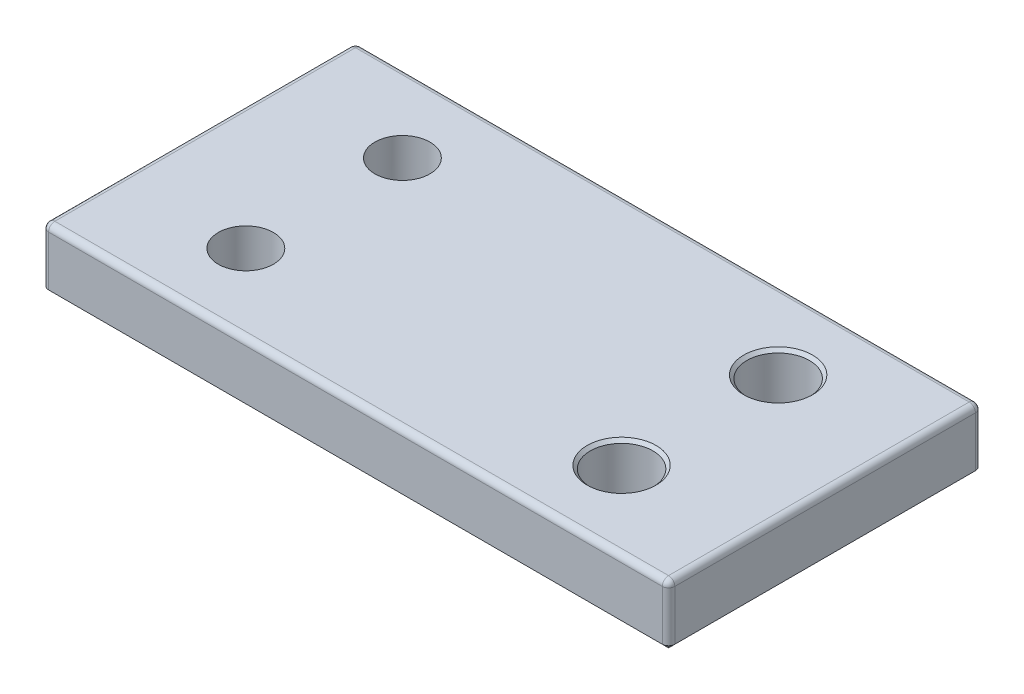
ISO-10303-21;
HEADER;
FILE_DESCRIPTION(('STEP AP214'),'2;1');
FILE_NAME('part.step','',(''),(''),'','','');
FILE_SCHEMA(('AUTOMOTIVE_DESIGN { 1 0 10303 214 1 1 1 1 }'));
ENDSEC;
DATA;
#1=APPLICATION_CONTEXT('core data for automotive mechanical design processes');
#2=APPLICATION_PROTOCOL_DEFINITION('international standard','automotive_design',2000,#1);
#3=PRODUCT_CONTEXT('',#1,'mechanical');
#4=PRODUCT('Part','Part','',(#3));
#5=PRODUCT_RELATED_PRODUCT_CATEGORY('part','',(#4));
#6=PRODUCT_DEFINITION_FORMATION('','',#4);
#7=PRODUCT_DEFINITION_CONTEXT('part definition',#1,'design');
#8=PRODUCT_DEFINITION('design','',#6,#7);
#9=PRODUCT_DEFINITION_SHAPE('','',#8);
#10=(LENGTH_UNIT() NAMED_UNIT(*) SI_UNIT(.MILLI.,.METRE.));
#11=(NAMED_UNIT(*) PLANE_ANGLE_UNIT() SI_UNIT($,.RADIAN.));
#12=(NAMED_UNIT(*) SI_UNIT($,.STERADIAN.) SOLID_ANGLE_UNIT());
#13=UNCERTAINTY_MEASURE_WITH_UNIT(LENGTH_MEASURE(1.E-05),#10,'distance_accuracy_value','');
#14=(GEOMETRIC_REPRESENTATION_CONTEXT(3) GLOBAL_UNCERTAINTY_ASSIGNED_CONTEXT((#13)) GLOBAL_UNIT_ASSIGNED_CONTEXT((#10,
#11,#12)) REPRESENTATION_CONTEXT('',''));
#15=CARTESIAN_POINT('',(0.,0.,0.));
#16=DIRECTION('',(0.,0.,1.));
#17=DIRECTION('',(1.,0.,0.));
#18=AXIS2_PLACEMENT_3D('',#15,#16,#17);
#19=CARTESIAN_POINT('',(0.,10.,0.));
#20=DIRECTION('',(1.,0.,0.));
#21=DIRECTION('',(0.,0.,-1.));
#22=AXIS2_PLACEMENT_3D('',#19,#20,#21);
#23=PLANE('',#22);
#24=DIRECTION('',(0.,-1.,0.));
#25=VECTOR('',#24,1.);
#26=CARTESIAN_POINT('',(0.,10.,-1.));
#27=LINE('',#26,#25);
#28=CARTESIAN_POINT('',(0.,1.,-1.));
#29=VERTEX_POINT('',#28);
#30=CARTESIAN_POINT('',(0.,9.,-1.));
#31=VERTEX_POINT('',#30);
#32=EDGE_CURVE('E273',#29,#31,#27,.F.);
#33=ORIENTED_EDGE('',*,*,#32,.T.);
#34=DIRECTION('',(0.,0.,1.));
#35=VECTOR('',#34,1.);
#36=CARTESIAN_POINT('',(0.,9.,0.));
#37=LINE('',#36,#35);
#38=CARTESIAN_POINT('',(0.,9.,-49.));
#39=VERTEX_POINT('',#38);
#40=EDGE_CURVE('E235',#31,#39,#37,.F.);
#41=ORIENTED_EDGE('',*,*,#40,.T.);
#42=DIRECTION('',(0.,-1.,0.));
#43=VECTOR('',#42,1.);
#44=CARTESIAN_POINT('',(0.,10.,-49.));
#45=LINE('',#44,#43);
#46=CARTESIAN_POINT('',(0.,1.,-49.));
#47=VERTEX_POINT('',#46);
#48=EDGE_CURVE('E276',#39,#47,#45,.T.);
#49=ORIENTED_EDGE('',*,*,#48,.T.);
#50=DIRECTION('',(0.,0.,1.));
#51=VECTOR('',#50,1.);
#52=CARTESIAN_POINT('',(0.,1.,-1.));
#53=LINE('',#52,#51);
#54=EDGE_CURVE('E151',#47,#29,#53,.T.);
#55=ORIENTED_EDGE('',*,*,#54,.T.);
#56=EDGE_LOOP('',(#33,#41,#49,#55));
#57=FACE_BOUND('',#56,.T.);
#58=ADVANCED_FACE('F37',(#57),#23,.F.);
#59=CARTESIAN_POINT('',(0.,10.,0.));
#60=DIRECTION('',(0.,0.,-1.));
#61=DIRECTION('',(-1.,0.,0.));
#62=AXIS2_PLACEMENT_3D('',#59,#60,#61);
#63=PLANE('',#62);
#64=DIRECTION('',(0.,-1.,0.));
#65=VECTOR('',#64,1.);
#66=CARTESIAN_POINT('',(99.,10.,0.));
#67=LINE('',#66,#65);
#68=CARTESIAN_POINT('',(99.,1.,0.));
#69=VERTEX_POINT('',#68);
#70=CARTESIAN_POINT('',(99.,9.,0.));
#71=VERTEX_POINT('',#70);
#72=EDGE_CURVE('E171',#69,#71,#67,.F.);
#73=ORIENTED_EDGE('',*,*,#72,.T.);
#74=DIRECTION('',(1.,0.,0.));
#75=VECTOR('',#74,1.);
#76=CARTESIAN_POINT('',(0.,9.,0.));
#77=LINE('',#76,#75);
#78=CARTESIAN_POINT('',(1.,9.,0.));
#79=VERTEX_POINT('',#78);
#80=EDGE_CURVE('E11',#71,#79,#77,.F.);
#81=ORIENTED_EDGE('',*,*,#80,.T.);
#82=DIRECTION('',(0.,-1.,0.));
#83=VECTOR('',#82,1.);
#84=CARTESIAN_POINT('',(1.,10.,0.));
#85=LINE('',#84,#83);
#86=CARTESIAN_POINT('',(1.,1.,0.));
#87=VERTEX_POINT('',#86);
#88=EDGE_CURVE('E167',#79,#87,#85,.T.);
#89=ORIENTED_EDGE('',*,*,#88,.T.);
#90=DIRECTION('',(1.,0.,0.));
#91=VECTOR('',#90,1.);
#92=CARTESIAN_POINT('',(99.,1.,0.));
#93=LINE('',#92,#91);
#94=EDGE_CURVE('E192',#87,#69,#93,.T.);
#95=ORIENTED_EDGE('',*,*,#94,.T.);
#96=EDGE_LOOP('',(#73,#81,#89,#95));
#97=FACE_BOUND('',#96,.T.);
#98=ADVANCED_FACE('F282',(#97),#63,.F.);
#99=CARTESIAN_POINT('',(100.,10.,0.));
#100=DIRECTION('',(-1.,0.,0.));
#101=DIRECTION('',(0.,0.,1.));
#102=AXIS2_PLACEMENT_3D('',#99,#100,#101);
#103=PLANE('',#102);
#104=DIRECTION('',(0.,-1.,0.));
#105=VECTOR('',#104,1.);
#106=CARTESIAN_POINT('',(100.,10.,-49.));
#107=LINE('',#106,#105);
#108=CARTESIAN_POINT('',(100.,1.,-49.));
#109=VERTEX_POINT('',#108);
#110=CARTESIAN_POINT('',(100.,9.,-49.));
#111=VERTEX_POINT('',#110);
#112=EDGE_CURVE('E147',#109,#111,#107,.F.);
#113=ORIENTED_EDGE('',*,*,#112,.T.);
#114=DIRECTION('',(0.,0.,-1.));
#115=VECTOR('',#114,1.);
#116=CARTESIAN_POINT('',(100.,9.,0.));
#117=LINE('',#116,#115);
#118=CARTESIAN_POINT('',(100.,9.,-1.));
#119=VERTEX_POINT('',#118);
#120=EDGE_CURVE('E61',#111,#119,#117,.F.);
#121=ORIENTED_EDGE('',*,*,#120,.T.);
#122=DIRECTION('',(0.,-1.,0.));
#123=VECTOR('',#122,1.);
#124=CARTESIAN_POINT('',(100.,10.,-1.));
#125=LINE('',#124,#123);
#126=CARTESIAN_POINT('',(100.,1.,-1.));
#127=VERTEX_POINT('',#126);
#128=EDGE_CURVE('E139',#119,#127,#125,.T.);
#129=ORIENTED_EDGE('',*,*,#128,.T.);
#130=DIRECTION('',(0.,0.,-1.));
#131=VECTOR('',#130,1.);
#132=CARTESIAN_POINT('',(100.,1.,-49.));
#133=LINE('',#132,#131);
#134=EDGE_CURVE('E184',#127,#109,#133,.T.);
#135=ORIENTED_EDGE('',*,*,#134,.T.);
#136=EDGE_LOOP('',(#113,#121,#129,#135));
#137=FACE_BOUND('',#136,.T.);
#138=ADVANCED_FACE('F271',(#137),#103,.F.);
#139=CARTESIAN_POINT('',(0.,10.,-50.));
#140=DIRECTION('',(0.,0.,1.));
#141=DIRECTION('',(1.,0.,0.));
#142=AXIS2_PLACEMENT_3D('',#139,#140,#141);
#143=PLANE('',#142);
#144=DIRECTION('',(0.,-1.,0.));
#145=VECTOR('',#144,1.);
#146=CARTESIAN_POINT('',(1.,10.,-50.));
#147=LINE('',#146,#145);
#148=CARTESIAN_POINT('',(1.,1.,-50.));
#149=VERTEX_POINT('',#148);
#150=CARTESIAN_POINT('',(1.,9.,-50.));
#151=VERTEX_POINT('',#150);
#152=EDGE_CURVE('E140',#149,#151,#147,.F.);
#153=ORIENTED_EDGE('',*,*,#152,.T.);
#154=DIRECTION('',(-1.,0.,0.));
#155=VECTOR('',#154,1.);
#156=CARTESIAN_POINT('',(0.,9.,-50.));
#157=LINE('',#156,#155);
#158=CARTESIAN_POINT('',(99.,9.,-50.));
#159=VERTEX_POINT('',#158);
#160=EDGE_CURVE('E136',#151,#159,#157,.F.);
#161=ORIENTED_EDGE('',*,*,#160,.T.);
#162=DIRECTION('',(0.,-1.,0.));
#163=VECTOR('',#162,1.);
#164=CARTESIAN_POINT('',(99.,10.,-50.));
#165=LINE('',#164,#163);
#166=CARTESIAN_POINT('',(99.,1.,-50.));
#167=VERTEX_POINT('',#166);
#168=EDGE_CURVE('E128',#159,#167,#165,.T.);
#169=ORIENTED_EDGE('',*,*,#168,.T.);
#170=DIRECTION('',(-1.,0.,0.));
#171=VECTOR('',#170,1.);
#172=CARTESIAN_POINT('',(1.,1.,-50.));
#173=LINE('',#172,#171);
#174=EDGE_CURVE('E133',#167,#149,#173,.T.);
#175=ORIENTED_EDGE('',*,*,#174,.T.);
#176=EDGE_LOOP('',(#153,#161,#169,#175));
#177=FACE_BOUND('',#176,.T.);
#178=ADVANCED_FACE('F131',(#177),#143,.F.);
#179=CARTESIAN_POINT('',(0.,10.,0.));
#180=DIRECTION('',(0.,-1.,0.));
#181=DIRECTION('',(0.,0.,-1.));
#182=AXIS2_PLACEMENT_3D('',#179,#180,#181);
#183=PLANE('',#182);
#184=DIRECTION('',(-1.,0.,0.));
#185=VECTOR('',#184,1.);
#186=CARTESIAN_POINT('',(0.,10.,-49.));
#187=LINE('',#186,#185);
#188=CARTESIAN_POINT('',(99.,10.,-49.));
#189=VERTEX_POINT('',#188);
#190=CARTESIAN_POINT('',(1.,10.,-49.));
#191=VERTEX_POINT('',#190);
#192=EDGE_CURVE('E230',#189,#191,#187,.T.);
#193=ORIENTED_EDGE('',*,*,#192,.T.);
#194=DIRECTION('',(0.,0.,1.));
#195=VECTOR('',#194,1.);
#196=CARTESIAN_POINT('',(1.,10.,0.));
#197=LINE('',#196,#195);
#198=CARTESIAN_POINT('',(1.,10.,-1.));
#199=VERTEX_POINT('',#198);
#200=EDGE_CURVE('E232',#191,#199,#197,.T.);
#201=ORIENTED_EDGE('',*,*,#200,.T.);
#202=DIRECTION('',(1.,0.,0.));
#203=VECTOR('',#202,1.);
#204=CARTESIAN_POINT('',(0.,10.,-1.));
#205=LINE('',#204,#203);
#206=CARTESIAN_POINT('',(99.,10.,-1.));
#207=VERTEX_POINT('',#206);
#208=EDGE_CURVE('E226',#199,#207,#205,.T.);
#209=ORIENTED_EDGE('',*,*,#208,.T.);
#210=DIRECTION('',(0.,0.,-1.));
#211=VECTOR('',#210,1.);
#212=CARTESIAN_POINT('',(99.,10.,0.));
#213=LINE('',#212,#211);
#214=EDGE_CURVE('E228',#207,#189,#213,.T.);
#215=ORIENTED_EDGE('',*,*,#214,.T.);
#216=EDGE_LOOP('',(#193,#201,#209,#215));
#217=FACE_BOUND('',#216,.T.);
#218=CARTESIAN_POINT('',(80.,10.,-37.5));
#219=DIRECTION('',(0.,-1.,0.));
#220=DIRECTION('',(0.,0.,-1.));
#221=AXIS2_PLACEMENT_3D('',#218,#219,#220);
#222=CIRCLE('',#221,5.50000000000001);
#223=CARTESIAN_POINT('',(80.,10.,-43.));
#224=VERTEX_POINT('',#223);
#225=EDGE_CURVE('E217',#224,#224,#222,.T.);
#226=ORIENTED_EDGE('',*,*,#225,.T.);
#227=EDGE_LOOP('',(#226));
#228=FACE_BOUND('',#227,.T.);
#229=CARTESIAN_POINT('',(80.,10.,-12.5));
#230=DIRECTION('',(0.,-1.,0.));
#231=DIRECTION('',(0.,0.,-1.));
#232=AXIS2_PLACEMENT_3D('',#229,#230,#231);
#233=CIRCLE('',#232,5.50000000000001);
#234=CARTESIAN_POINT('',(80.,10.,-18.));
#235=VERTEX_POINT('',#234);
#236=EDGE_CURVE('E214',#235,#235,#233,.T.);
#237=ORIENTED_EDGE('',*,*,#236,.T.);
#238=EDGE_LOOP('',(#237));
#239=FACE_BOUND('',#238,.T.);
#240=CARTESIAN_POINT('',(20.,10.,-37.5));
#241=DIRECTION('',(0.,1.,0.));
#242=DIRECTION('',(0.,0.,1.));
#243=AXIS2_PLACEMENT_3D('',#240,#241,#242);
#244=CIRCLE('',#243,4.4);
#245=CARTESIAN_POINT('',(20.,10.,-33.1));
#246=VERTEX_POINT('',#245);
#247=EDGE_CURVE('E211',#246,#246,#244,.T.);
#248=ORIENTED_EDGE('',*,*,#247,.F.);
#249=EDGE_LOOP('',(#248));
#250=FACE_BOUND('',#249,.T.);
#251=CARTESIAN_POINT('',(20.,10.,-12.5));
#252=DIRECTION('',(0.,1.,0.));
#253=DIRECTION('',(0.,0.,1.));
#254=AXIS2_PLACEMENT_3D('',#251,#252,#253);
#255=CIRCLE('',#254,4.4);
#256=CARTESIAN_POINT('',(20.,10.,-8.1));
#257=VERTEX_POINT('',#256);
#258=EDGE_CURVE('E331',#257,#257,#255,.T.);
#259=ORIENTED_EDGE('',*,*,#258,.F.);
#260=EDGE_LOOP('',(#259));
#261=FACE_BOUND('',#260,.T.);
#262=ADVANCED_FACE('F342',(#217,#228,#239,#250,#261),#183,.F.);
#263=CARTESIAN_POINT('',(0.,0.,0.));
#264=DIRECTION('',(0.,-1.,0.));
#265=DIRECTION('',(0.,0.,-1.));
#266=AXIS2_PLACEMENT_3D('',#263,#264,#265);
#267=PLANE('',#266);
#268=DIRECTION('',(0.,0.,-1.));
#269=VECTOR('',#268,1.);
#270=CARTESIAN_POINT('',(1.,0.,-49.));
#271=LINE('',#270,#269);
#272=CARTESIAN_POINT('',(1.,0.,-1.));
#273=VERTEX_POINT('',#272);
#274=CARTESIAN_POINT('',(1.,0.,-49.));
#275=VERTEX_POINT('',#274);
#276=EDGE_CURVE('E176',#273,#275,#271,.T.);
#277=ORIENTED_EDGE('',*,*,#276,.T.);
#278=DIRECTION('',(1.,0.,0.));
#279=VECTOR('',#278,1.);
#280=CARTESIAN_POINT('',(99.,0.,-49.));
#281=LINE('',#280,#279);
#282=CARTESIAN_POINT('',(99.,0.,-49.));
#283=VERTEX_POINT('',#282);
#284=EDGE_CURVE('E178',#275,#283,#281,.T.);
#285=ORIENTED_EDGE('',*,*,#284,.T.);
#286=DIRECTION('',(0.,0.,1.));
#287=VECTOR('',#286,1.);
#288=CARTESIAN_POINT('',(99.,0.,-1.));
#289=LINE('',#288,#287);
#290=CARTESIAN_POINT('',(99.,0.,-1.));
#291=VERTEX_POINT('',#290);
#292=EDGE_CURVE('E169',#283,#291,#289,.T.);
#293=ORIENTED_EDGE('',*,*,#292,.T.);
#294=DIRECTION('',(-1.,0.,0.));
#295=VECTOR('',#294,1.);
#296=CARTESIAN_POINT('',(1.,0.,-1.));
#297=LINE('',#296,#295);
#298=EDGE_CURVE('E166',#291,#273,#297,.T.);
#299=ORIENTED_EDGE('',*,*,#298,.T.);
#300=EDGE_LOOP('',(#277,#285,#293,#299));
#301=FACE_BOUND('',#300,.T.);
#302=CARTESIAN_POINT('',(20.,0.,-37.5));
#303=DIRECTION('',(0.,-1.,0.));
#304=DIRECTION('',(0.,0.,-1.));
#305=AXIS2_PLACEMENT_3D('',#302,#303,#304);
#306=CIRCLE('',#305,4.4);
#307=CARTESIAN_POINT('',(20.,0.,-41.9));
#308=VERTEX_POINT('',#307);
#309=EDGE_CURVE('E334',#308,#308,#306,.T.);
#310=ORIENTED_EDGE('',*,*,#309,.F.);
#311=EDGE_LOOP('',(#310));
#312=FACE_BOUND('',#311,.T.);
#313=CARTESIAN_POINT('',(20.,0.,-12.5));
#314=DIRECTION('',(0.,-1.,0.));
#315=DIRECTION('',(0.,0.,-1.));
#316=AXIS2_PLACEMENT_3D('',#313,#314,#315);
#317=CIRCLE('',#316,4.4);
#318=CARTESIAN_POINT('',(20.,0.,-16.9));
#319=VERTEX_POINT('',#318);
#320=EDGE_CURVE('E327',#319,#319,#317,.T.);
#321=ORIENTED_EDGE('',*,*,#320,.F.);
#322=EDGE_LOOP('',(#321));
#323=FACE_BOUND('',#322,.T.);
#324=CARTESIAN_POINT('',(80.,0.,-37.5));
#325=DIRECTION('',(0.,-1.,0.));
#326=DIRECTION('',(0.,0.,-1.));
#327=AXIS2_PLACEMENT_3D('',#324,#325,#326);
#328=CIRCLE('',#327,4.99999999999999);
#329=CARTESIAN_POINT('',(80.,0.,-42.5));
#330=VERTEX_POINT('',#329);
#331=EDGE_CURVE('E323',#330,#330,#328,.T.);
#332=ORIENTED_EDGE('',*,*,#331,.F.);
#333=EDGE_LOOP('',(#332));
#334=FACE_BOUND('',#333,.T.);
#335=CARTESIAN_POINT('',(80.,0.,-12.5));
#336=DIRECTION('',(0.,-1.,0.));
#337=DIRECTION('',(0.,0.,-1.));
#338=AXIS2_PLACEMENT_3D('',#335,#336,#337);
#339=CIRCLE('',#338,4.99999999999999);
#340=CARTESIAN_POINT('',(80.,0.,-17.5));
#341=VERTEX_POINT('',#340);
#342=EDGE_CURVE('E320',#341,#341,#339,.T.);
#343=ORIENTED_EDGE('',*,*,#342,.F.);
#344=EDGE_LOOP('',(#343));
#345=FACE_BOUND('',#344,.T.);
#346=ADVANCED_FACE('F345',(#301,#312,#323,#334,#345),#267,.T.);
#347=CARTESIAN_POINT('',(80.,10.,-12.5));
#348=DIRECTION('',(0.,1.,0.));
#349=DIRECTION('',(0.,0.,1.));
#350=AXIS2_PLACEMENT_3D('',#347,#348,#349);
#351=CYLINDRICAL_SURFACE('',#350,4.99999999999999);
#352=CARTESIAN_POINT('',(80.,9.49999999999998,-12.5));
#353=DIRECTION('',(0.,-1.,0.));
#354=DIRECTION('',(0.,0.,-1.));
#355=AXIS2_PLACEMENT_3D('',#352,#353,#354);
#356=CIRCLE('',#355,4.99999999999999);
#357=CARTESIAN_POINT('',(80.,9.49999999999998,-17.5));
#358=VERTEX_POINT('',#357);
#359=EDGE_CURVE('E220',#358,#358,#356,.F.);
#360=ORIENTED_EDGE('',*,*,#359,.T.);
#361=EDGE_LOOP('',(#360));
#362=FACE_BOUND('',#361,.T.);
#363=ORIENTED_EDGE('',*,*,#342,.T.);
#364=EDGE_LOOP('',(#363));
#365=FACE_BOUND('',#364,.T.);
#366=ADVANCED_FACE('F361',(#362,#365),#351,.F.);
#367=CARTESIAN_POINT('',(80.,10.,-37.5));
#368=DIRECTION('',(0.,1.,0.));
#369=DIRECTION('',(0.,0.,1.));
#370=AXIS2_PLACEMENT_3D('',#367,#368,#369);
#371=CYLINDRICAL_SURFACE('',#370,4.99999999999999);
#372=CARTESIAN_POINT('',(80.,9.49999999999998,-37.5));
#373=DIRECTION('',(0.,-1.,0.));
#374=DIRECTION('',(0.,0.,-1.));
#375=AXIS2_PLACEMENT_3D('',#372,#373,#374);
#376=CIRCLE('',#375,4.99999999999999);
#377=CARTESIAN_POINT('',(80.,9.49999999999998,-42.5));
#378=VERTEX_POINT('',#377);
#379=EDGE_CURVE('E194',#378,#378,#376,.F.);
#380=ORIENTED_EDGE('',*,*,#379,.T.);
#381=EDGE_LOOP('',(#380));
#382=FACE_BOUND('',#381,.T.);
#383=ORIENTED_EDGE('',*,*,#331,.T.);
#384=EDGE_LOOP('',(#383));
#385=FACE_BOUND('',#384,.T.);
#386=ADVANCED_FACE('F352',(#382,#385),#371,.F.);
#387=CARTESIAN_POINT('',(20.,10.,-12.5));
#388=DIRECTION('',(0.,1.,0.));
#389=DIRECTION('',(0.,0.,1.));
#390=AXIS2_PLACEMENT_3D('',#387,#388,#389);
#391=CYLINDRICAL_SURFACE('',#390,4.4);
#392=ORIENTED_EDGE('',*,*,#320,.T.);
#393=EDGE_LOOP('',(#392));
#394=FACE_BOUND('',#393,.T.);
#395=ORIENTED_EDGE('',*,*,#258,.T.);
#396=EDGE_LOOP('',(#395));
#397=FACE_BOUND('',#396,.T.);
#398=ADVANCED_FACE('F350',(#394,#397),#391,.F.);
#399=CARTESIAN_POINT('',(20.,10.,-37.5));
#400=DIRECTION('',(0.,1.,0.));
#401=DIRECTION('',(0.,0.,1.));
#402=AXIS2_PLACEMENT_3D('',#399,#400,#401);
#403=CYLINDRICAL_SURFACE('',#402,4.4);
#404=ORIENTED_EDGE('',*,*,#309,.T.);
#405=EDGE_LOOP('',(#404));
#406=FACE_BOUND('',#405,.T.);
#407=ORIENTED_EDGE('',*,*,#247,.T.);
#408=EDGE_LOOP('',(#407));
#409=FACE_BOUND('',#408,.T.);
#410=ADVANCED_FACE('F340',(#406,#409),#403,.F.);
#411=CARTESIAN_POINT('',(99.,10.,-49.));
#412=DIRECTION('',(0.,-1.,0.));
#413=DIRECTION('',(0.,0.,-1.));
#414=AXIS2_PLACEMENT_3D('',#411,#412,#413);
#415=CYLINDRICAL_SURFACE('',#414,1.);
#416=ORIENTED_EDGE('',*,*,#168,.F.);
#417=CARTESIAN_POINT('',(99.,9.,-49.));
#418=DIRECTION('',(0.,-1.,0.));
#419=DIRECTION('',(0.,0.,-1.));
#420=AXIS2_PLACEMENT_3D('',#417,#418,#419);
#421=CIRCLE('',#420,1.);
#422=EDGE_CURVE('E240',#159,#111,#421,.T.);
#423=ORIENTED_EDGE('',*,*,#422,.T.);
#424=ORIENTED_EDGE('',*,*,#112,.F.);
#425=CARTESIAN_POINT('',(99.,1.,-49.));
#426=DIRECTION('',(0.,-1.,0.));
#427=DIRECTION('',(0.,0.,-1.));
#428=AXIS2_PLACEMENT_3D('',#425,#426,#427);
#429=CIRCLE('',#428,1.);
#430=EDGE_CURVE('E144',#109,#167,#429,.F.);
#431=ORIENTED_EDGE('',*,*,#430,.T.);
#432=EDGE_LOOP('',(#416,#423,#424,#431));
#433=FACE_BOUND('',#432,.T.);
#434=ADVANCED_FACE('F146',(#433),#415,.T.);
#435=CARTESIAN_POINT('',(1.,10.,-49.));
#436=DIRECTION('',(0.,-1.,0.));
#437=DIRECTION('',(0.,0.,-1.));
#438=AXIS2_PLACEMENT_3D('',#435,#436,#437);
#439=CYLINDRICAL_SURFACE('',#438,1.);
#440=ORIENTED_EDGE('',*,*,#48,.F.);
#441=CARTESIAN_POINT('',(1.,9.,-49.));
#442=DIRECTION('',(0.,-1.,0.));
#443=DIRECTION('',(0.,0.,-1.));
#444=AXIS2_PLACEMENT_3D('',#441,#442,#443);
#445=CIRCLE('',#444,1.);
#446=EDGE_CURVE('E237',#39,#151,#445,.T.);
#447=ORIENTED_EDGE('',*,*,#446,.T.);
#448=ORIENTED_EDGE('',*,*,#152,.F.);
#449=CARTESIAN_POINT('',(1.,1.,-49.));
#450=DIRECTION('',(0.,-1.,0.));
#451=DIRECTION('',(0.,0.,-1.));
#452=AXIS2_PLACEMENT_3D('',#449,#450,#451);
#453=CIRCLE('',#452,1.);
#454=EDGE_CURVE('E152',#149,#47,#453,.F.);
#455=ORIENTED_EDGE('',*,*,#454,.T.);
#456=EDGE_LOOP('',(#440,#447,#448,#455));
#457=FACE_BOUND('',#456,.T.);
#458=ADVANCED_FACE('F318',(#457),#439,.T.);
#459=CARTESIAN_POINT('',(1.,10.,-1.));
#460=DIRECTION('',(0.,-1.,0.));
#461=DIRECTION('',(0.,0.,-1.));
#462=AXIS2_PLACEMENT_3D('',#459,#460,#461);
#463=CYLINDRICAL_SURFACE('',#462,1.);
#464=ORIENTED_EDGE('',*,*,#88,.F.);
#465=CARTESIAN_POINT('',(1.,9.,-1.));
#466=DIRECTION('',(0.,-1.,0.));
#467=DIRECTION('',(0.,0.,-1.));
#468=AXIS2_PLACEMENT_3D('',#465,#466,#467);
#469=CIRCLE('',#468,1.);
#470=EDGE_CURVE('E223',#79,#31,#469,.T.);
#471=ORIENTED_EDGE('',*,*,#470,.T.);
#472=ORIENTED_EDGE('',*,*,#32,.F.);
#473=CARTESIAN_POINT('',(1.,1.,-1.));
#474=DIRECTION('',(0.,-1.,0.));
#475=DIRECTION('',(0.,0.,-1.));
#476=AXIS2_PLACEMENT_3D('',#473,#474,#475);
#477=CIRCLE('',#476,1.);
#478=EDGE_CURVE('E186',#29,#87,#477,.F.);
#479=ORIENTED_EDGE('',*,*,#478,.T.);
#480=EDGE_LOOP('',(#464,#471,#472,#479));
#481=FACE_BOUND('',#480,.T.);
#482=ADVANCED_FACE('F307',(#481),#463,.T.);
#483=CARTESIAN_POINT('',(99.,10.,-1.));
#484=DIRECTION('',(0.,-1.,0.));
#485=DIRECTION('',(0.,0.,-1.));
#486=AXIS2_PLACEMENT_3D('',#483,#484,#485);
#487=CYLINDRICAL_SURFACE('',#486,1.);
#488=ORIENTED_EDGE('',*,*,#128,.F.);
#489=CARTESIAN_POINT('',(99.,9.,-1.));
#490=DIRECTION('',(0.,-1.,0.));
#491=DIRECTION('',(0.,0.,-1.));
#492=AXIS2_PLACEMENT_3D('',#489,#490,#491);
#493=CIRCLE('',#492,1.);
#494=EDGE_CURVE('E46',#119,#71,#493,.T.);
#495=ORIENTED_EDGE('',*,*,#494,.T.);
#496=ORIENTED_EDGE('',*,*,#72,.F.);
#497=CARTESIAN_POINT('',(99.,1.,-1.));
#498=DIRECTION('',(0.,-1.,0.));
#499=DIRECTION('',(0.,0.,-1.));
#500=AXIS2_PLACEMENT_3D('',#497,#498,#499);
#501=CIRCLE('',#500,1.);
#502=EDGE_CURVE('E189',#69,#127,#501,.F.);
#503=ORIENTED_EDGE('',*,*,#502,.T.);
#504=EDGE_LOOP('',(#488,#495,#496,#503));
#505=FACE_BOUND('',#504,.T.);
#506=ADVANCED_FACE('F378',(#505),#487,.T.);
#507=CARTESIAN_POINT('',(0.,1.,0.));
#508=DIRECTION('',(0.,-0.707106781186547,0.707106781186547));
#509=DIRECTION('',(-1.,0.,0.));
#510=AXIS2_PLACEMENT_3D('',#507,#508,#509);
#511=PLANE('',#510);
#512=DIRECTION('',(0.,-0.707106781186547,-0.707106781186547));
#513=VECTOR('',#512,1.);
#514=CARTESIAN_POINT('',(99.,1.,0.));
#515=LINE('',#514,#513);
#516=EDGE_CURVE('E208',#69,#291,#515,.T.);
#517=ORIENTED_EDGE('',*,*,#516,.F.);
#518=ORIENTED_EDGE('',*,*,#94,.F.);
#519=DIRECTION('',(0.,0.707106781186547,0.707106781186547));
#520=VECTOR('',#519,1.);
#521=CARTESIAN_POINT('',(1.,0.,-1.));
#522=LINE('',#521,#520);
#523=EDGE_CURVE('E205',#273,#87,#522,.T.);
#524=ORIENTED_EDGE('',*,*,#523,.F.);
#525=ORIENTED_EDGE('',*,*,#298,.F.);
#526=EDGE_LOOP('',(#517,#518,#524,#525));
#527=FACE_BOUND('',#526,.T.);
#528=ADVANCED_FACE('F381',(#527),#511,.T.);
#529=CARTESIAN_POINT('',(99.,1.,-1.));
#530=DIRECTION('',(0.,1.,0.));
#531=DIRECTION('',(0.,0.,1.));
#532=AXIS2_PLACEMENT_3D('',#529,#530,#531);
#533=CONICAL_SURFACE('',#532,1.,0.785398163397448);
#534=ORIENTED_EDGE('',*,*,#502,.F.);
#535=ORIENTED_EDGE('',*,*,#516,.T.);
#536=DIRECTION('',(-0.707106781186547,-0.707106781186547,0.));
#537=VECTOR('',#536,1.);
#538=CARTESIAN_POINT('',(100.,1.,-1.));
#539=LINE('',#538,#537);
#540=EDGE_CURVE('E202',#127,#291,#539,.T.);
#541=ORIENTED_EDGE('',*,*,#540,.F.);
#542=EDGE_LOOP('',(#534,#535,#541));
#543=FACE_BOUND('',#542,.T.);
#544=ADVANCED_FACE('F398',(#543),#533,.T.);
#545=CARTESIAN_POINT('',(1.,1.,-1.));
#546=DIRECTION('',(0.,1.,0.));
#547=DIRECTION('',(0.,0.,1.));
#548=AXIS2_PLACEMENT_3D('',#545,#546,#547);
#549=CONICAL_SURFACE('',#548,1.,0.785398163397448);
#550=ORIENTED_EDGE('',*,*,#523,.T.);
#551=ORIENTED_EDGE('',*,*,#478,.F.);
#552=DIRECTION('',(-0.707106781186547,0.707106781186547,0.));
#553=VECTOR('',#552,1.);
#554=CARTESIAN_POINT('',(1.,0.,-1.));
#555=LINE('',#554,#553);
#556=EDGE_CURVE('E199',#273,#29,#555,.T.);
#557=ORIENTED_EDGE('',*,*,#556,.F.);
#558=EDGE_LOOP('',(#550,#551,#557));
#559=FACE_BOUND('',#558,.T.);
#560=ADVANCED_FACE('F394',(#559),#549,.T.);
#561=CARTESIAN_POINT('',(100.,1.,0.));
#562=DIRECTION('',(0.707106781186547,-0.707106781186547,0.));
#563=DIRECTION('',(0.,0.,1.));
#564=AXIS2_PLACEMENT_3D('',#561,#562,#563);
#565=PLANE('',#564);
#566=ORIENTED_EDGE('',*,*,#540,.T.);
#567=ORIENTED_EDGE('',*,*,#292,.F.);
#568=DIRECTION('',(-0.707106781186547,-0.707106781186547,0.));
#569=VECTOR('',#568,1.);
#570=CARTESIAN_POINT('',(100.,1.,-49.));
#571=LINE('',#570,#569);
#572=EDGE_CURVE('E156',#109,#283,#571,.T.);
#573=ORIENTED_EDGE('',*,*,#572,.F.);
#574=ORIENTED_EDGE('',*,*,#134,.F.);
#575=EDGE_LOOP('',(#566,#567,#573,#574));
#576=FACE_BOUND('',#575,.T.);
#577=ADVANCED_FACE('F391',(#576),#565,.T.);
#578=CARTESIAN_POINT('',(0.,1.,0.));
#579=DIRECTION('',(-0.707106781186547,-0.707106781186547,0.));
#580=DIRECTION('',(0.,0.,-1.));
#581=AXIS2_PLACEMENT_3D('',#578,#579,#580);
#582=PLANE('',#581);
#583=ORIENTED_EDGE('',*,*,#556,.T.);
#584=ORIENTED_EDGE('',*,*,#54,.F.);
#585=DIRECTION('',(-0.707106781186547,0.707106781186547,0.));
#586=VECTOR('',#585,1.);
#587=CARTESIAN_POINT('',(1.,0.,-49.));
#588=LINE('',#587,#586);
#589=EDGE_CURVE('E160',#275,#47,#588,.T.);
#590=ORIENTED_EDGE('',*,*,#589,.F.);
#591=ORIENTED_EDGE('',*,*,#276,.F.);
#592=EDGE_LOOP('',(#583,#584,#590,#591));
#593=FACE_BOUND('',#592,.T.);
#594=ADVANCED_FACE('F312',(#593),#582,.T.);
#595=CARTESIAN_POINT('',(99.,1.,-49.));
#596=DIRECTION('',(0.,1.,0.));
#597=DIRECTION('',(0.,0.,1.));
#598=AXIS2_PLACEMENT_3D('',#595,#596,#597);
#599=CONICAL_SURFACE('',#598,1.,0.785398163397448);
#600=ORIENTED_EDGE('',*,*,#430,.F.);
#601=ORIENTED_EDGE('',*,*,#572,.T.);
#602=DIRECTION('',(0.,-0.707106781186547,0.707106781186547));
#603=VECTOR('',#602,1.);
#604=CARTESIAN_POINT('',(99.,1.,-50.));
#605=LINE('',#604,#603);
#606=EDGE_CURVE('E154',#167,#283,#605,.T.);
#607=ORIENTED_EDGE('',*,*,#606,.F.);
#608=EDGE_LOOP('',(#600,#601,#607));
#609=FACE_BOUND('',#608,.T.);
#610=ADVANCED_FACE('F155',(#609),#599,.T.);
#611=CARTESIAN_POINT('',(1.,1.,-49.));
#612=DIRECTION('',(0.,1.,0.));
#613=DIRECTION('',(0.,0.,1.));
#614=AXIS2_PLACEMENT_3D('',#611,#612,#613);
#615=CONICAL_SURFACE('',#614,1.,0.785398163397448);
#616=ORIENTED_EDGE('',*,*,#589,.T.);
#617=ORIENTED_EDGE('',*,*,#454,.F.);
#618=DIRECTION('',(0.,0.707106781186547,-0.707106781186547));
#619=VECTOR('',#618,1.);
#620=CARTESIAN_POINT('',(1.,0.,-49.));
#621=LINE('',#620,#619);
#622=EDGE_CURVE('E161',#275,#149,#621,.T.);
#623=ORIENTED_EDGE('',*,*,#622,.F.);
#624=EDGE_LOOP('',(#616,#617,#623));
#625=FACE_BOUND('',#624,.T.);
#626=ADVANCED_FACE('F316',(#625),#615,.T.);
#627=CARTESIAN_POINT('',(0.,1.,-50.));
#628=DIRECTION('',(0.,-0.707106781186547,-0.707106781186547));
#629=DIRECTION('',(1.,0.,0.));
#630=AXIS2_PLACEMENT_3D('',#627,#628,#629);
#631=PLANE('',#630);
#632=ORIENTED_EDGE('',*,*,#606,.T.);
#633=ORIENTED_EDGE('',*,*,#284,.F.);
#634=ORIENTED_EDGE('',*,*,#622,.T.);
#635=ORIENTED_EDGE('',*,*,#174,.F.);
#636=EDGE_LOOP('',(#632,#633,#634,#635));
#637=FACE_BOUND('',#636,.T.);
#638=ADVANCED_FACE('F163',(#637),#631,.T.);
#639=CARTESIAN_POINT('',(80.,9.49999999999998,-37.5));
#640=DIRECTION('',(0.,1.,0.));
#641=DIRECTION('',(0.,0.,1.));
#642=AXIS2_PLACEMENT_3D('',#639,#640,#641);
#643=CONICAL_SURFACE('',#642,4.99999999999999,0.785398163397445);
#644=ORIENTED_EDGE('',*,*,#225,.F.);
#645=EDGE_LOOP('',(#644));
#646=FACE_BOUND('',#645,.T.);
#647=ORIENTED_EDGE('',*,*,#379,.F.);
#648=EDGE_LOOP('',(#647));
#649=FACE_BOUND('',#648,.T.);
#650=ADVANCED_FACE('F384',(#646,#649),#643,.F.);
#651=CARTESIAN_POINT('',(80.,9.49999999999998,-12.5));
#652=DIRECTION('',(0.,1.,0.));
#653=DIRECTION('',(0.,0.,1.));
#654=AXIS2_PLACEMENT_3D('',#651,#652,#653);
#655=CONICAL_SURFACE('',#654,4.99999999999999,0.785398163397445);
#656=ORIENTED_EDGE('',*,*,#236,.F.);
#657=EDGE_LOOP('',(#656));
#658=FACE_BOUND('',#657,.T.);
#659=ORIENTED_EDGE('',*,*,#359,.F.);
#660=EDGE_LOOP('',(#659));
#661=FACE_BOUND('',#660,.T.);
#662=ADVANCED_FACE('F408',(#658,#661),#655,.F.);
#663=CARTESIAN_POINT('',(99.,9.,-49.));
#664=DIRECTION('',(0.,-1.,0.));
#665=DIRECTION('',(0.,0.,-1.));
#666=AXIS2_PLACEMENT_3D('',#663,#664,#665);
#667=SPHERICAL_SURFACE('',#666,1.);
#668=CARTESIAN_POINT('',(99.,9.,-49.));
#669=DIRECTION('',(0.,0.,1.));
#670=DIRECTION('',(1.,0.,0.));
#671=AXIS2_PLACEMENT_3D('',#668,#669,#670);
#672=CIRCLE('',#671,1.);
#673=EDGE_CURVE('E259',#111,#189,#672,.T.);
#674=ORIENTED_EDGE('',*,*,#673,.F.);
#675=ORIENTED_EDGE('',*,*,#422,.F.);
#676=CARTESIAN_POINT('',(99.,9.,-49.));
#677=DIRECTION('',(-1.,0.,0.));
#678=DIRECTION('',(0.,0.,1.));
#679=AXIS2_PLACEMENT_3D('',#676,#677,#678);
#680=CIRCLE('',#679,1.);
#681=EDGE_CURVE('E41',#189,#159,#680,.T.);
#682=ORIENTED_EDGE('',*,*,#681,.F.);
#683=EDGE_LOOP('',(#674,#675,#682));
#684=FACE_BOUND('',#683,.T.);
#685=ADVANCED_FACE('F39',(#684),#667,.T.);
#686=CARTESIAN_POINT('',(0.,9.,-49.));
#687=DIRECTION('',(-1.,0.,0.));
#688=DIRECTION('',(0.,0.,1.));
#689=AXIS2_PLACEMENT_3D('',#686,#687,#688);
#690=CYLINDRICAL_SURFACE('',#689,1.);
#691=ORIENTED_EDGE('',*,*,#681,.T.);
#692=ORIENTED_EDGE('',*,*,#160,.F.);
#693=CARTESIAN_POINT('',(1.,9.,-49.));
#694=DIRECTION('',(-1.,0.,0.));
#695=DIRECTION('',(0.,0.,1.));
#696=AXIS2_PLACEMENT_3D('',#693,#694,#695);
#697=CIRCLE('',#696,1.);
#698=EDGE_CURVE('E257',#191,#151,#697,.T.);
#699=ORIENTED_EDGE('',*,*,#698,.F.);
#700=ORIENTED_EDGE('',*,*,#192,.F.);
#701=EDGE_LOOP('',(#691,#692,#699,#700));
#702=FACE_BOUND('',#701,.T.);
#703=ADVANCED_FACE('F268',(#702),#690,.T.);
#704=CARTESIAN_POINT('',(99.,9.,0.));
#705=DIRECTION('',(0.,0.,-1.));
#706=DIRECTION('',(-1.,0.,0.));
#707=AXIS2_PLACEMENT_3D('',#704,#705,#706);
#708=CYLINDRICAL_SURFACE('',#707,1.);
#709=ORIENTED_EDGE('',*,*,#673,.T.);
#710=ORIENTED_EDGE('',*,*,#214,.F.);
#711=CARTESIAN_POINT('',(99.,9.,-1.));
#712=DIRECTION('',(0.,0.,1.));
#713=DIRECTION('',(1.,0.,0.));
#714=AXIS2_PLACEMENT_3D('',#711,#712,#713);
#715=CIRCLE('',#714,1.);
#716=EDGE_CURVE('E254',#119,#207,#715,.T.);
#717=ORIENTED_EDGE('',*,*,#716,.F.);
#718=ORIENTED_EDGE('',*,*,#120,.F.);
#719=EDGE_LOOP('',(#709,#710,#717,#718));
#720=FACE_BOUND('',#719,.T.);
#721=ADVANCED_FACE('F424',(#720),#708,.T.);
#722=CARTESIAN_POINT('',(1.,9.,-49.));
#723=DIRECTION('',(0.,-1.,0.));
#724=DIRECTION('',(0.,0.,-1.));
#725=AXIS2_PLACEMENT_3D('',#722,#723,#724);
#726=SPHERICAL_SURFACE('',#725,1.);
#727=ORIENTED_EDGE('',*,*,#698,.T.);
#728=ORIENTED_EDGE('',*,*,#446,.F.);
#729=CARTESIAN_POINT('',(1.,9.,-49.));
#730=DIRECTION('',(0.,0.,1.));
#731=DIRECTION('',(1.,0.,0.));
#732=AXIS2_PLACEMENT_3D('',#729,#730,#731);
#733=CIRCLE('',#732,1.);
#734=EDGE_CURVE('E251',#191,#39,#733,.T.);
#735=ORIENTED_EDGE('',*,*,#734,.F.);
#736=EDGE_LOOP('',(#727,#728,#735));
#737=FACE_BOUND('',#736,.T.);
#738=ADVANCED_FACE('F421',(#737),#726,.T.);
#739=CARTESIAN_POINT('',(99.,9.,-1.));
#740=DIRECTION('',(0.,-1.,0.));
#741=DIRECTION('',(0.,0.,-1.));
#742=AXIS2_PLACEMENT_3D('',#739,#740,#741);
#743=SPHERICAL_SURFACE('',#742,1.);
#744=ORIENTED_EDGE('',*,*,#494,.F.);
#745=ORIENTED_EDGE('',*,*,#716,.T.);
#746=CARTESIAN_POINT('',(99.,9.,-1.));
#747=DIRECTION('',(-1.,0.,0.));
#748=DIRECTION('',(0.,0.,1.));
#749=AXIS2_PLACEMENT_3D('',#746,#747,#748);
#750=CIRCLE('',#749,1.);
#751=EDGE_CURVE('E248',#71,#207,#750,.T.);
#752=ORIENTED_EDGE('',*,*,#751,.F.);
#753=EDGE_LOOP('',(#744,#745,#752));
#754=FACE_BOUND('',#753,.T.);
#755=ADVANCED_FACE('F288',(#754),#743,.T.);
#756=CARTESIAN_POINT('',(1.,9.,0.));
#757=DIRECTION('',(0.,0.,1.));
#758=DIRECTION('',(1.,0.,0.));
#759=AXIS2_PLACEMENT_3D('',#756,#757,#758);
#760=CYLINDRICAL_SURFACE('',#759,1.);
#761=ORIENTED_EDGE('',*,*,#734,.T.);
#762=ORIENTED_EDGE('',*,*,#40,.F.);
#763=CARTESIAN_POINT('',(1.,9.,-1.));
#764=DIRECTION('',(0.,0.,1.));
#765=DIRECTION('',(1.,0.,0.));
#766=AXIS2_PLACEMENT_3D('',#763,#764,#765);
#767=CIRCLE('',#766,1.);
#768=EDGE_CURVE('E246',#199,#31,#767,.T.);
#769=ORIENTED_EDGE('',*,*,#768,.F.);
#770=ORIENTED_EDGE('',*,*,#200,.F.);
#771=EDGE_LOOP('',(#761,#762,#769,#770));
#772=FACE_BOUND('',#771,.T.);
#773=ADVANCED_FACE('F301',(#772),#760,.T.);
#774=CARTESIAN_POINT('',(0.,9.,-1.));
#775=DIRECTION('',(1.,0.,0.));
#776=DIRECTION('',(0.,0.,-1.));
#777=AXIS2_PLACEMENT_3D('',#774,#775,#776);
#778=CYLINDRICAL_SURFACE('',#777,1.);
#779=ORIENTED_EDGE('',*,*,#751,.T.);
#780=ORIENTED_EDGE('',*,*,#208,.F.);
#781=CARTESIAN_POINT('',(1.,9.,-1.));
#782=DIRECTION('',(-1.,0.,0.));
#783=DIRECTION('',(0.,0.,1.));
#784=AXIS2_PLACEMENT_3D('',#781,#782,#783);
#785=CIRCLE('',#784,1.);
#786=EDGE_CURVE('E244',#79,#199,#785,.T.);
#787=ORIENTED_EDGE('',*,*,#786,.F.);
#788=ORIENTED_EDGE('',*,*,#80,.F.);
#789=EDGE_LOOP('',(#779,#780,#787,#788));
#790=FACE_BOUND('',#789,.T.);
#791=ADVANCED_FACE('F293',(#790),#778,.T.);
#792=CARTESIAN_POINT('',(1.,9.,-1.));
#793=DIRECTION('',(0.,-1.,0.));
#794=DIRECTION('',(0.,0.,-1.));
#795=AXIS2_PLACEMENT_3D('',#792,#793,#794);
#796=SPHERICAL_SURFACE('',#795,1.);
#797=ORIENTED_EDGE('',*,*,#768,.T.);
#798=ORIENTED_EDGE('',*,*,#470,.F.);
#799=ORIENTED_EDGE('',*,*,#786,.T.);
#800=EDGE_LOOP('',(#797,#798,#799));
#801=FACE_BOUND('',#800,.T.);
#802=ADVANCED_FACE('F297',(#801),#796,.T.);
#803=CLOSED_SHELL('',(#58,#98,#138,#178,#262,#346,#366,#386,#398,#410,#434,#458,#482,#506,#528,
#544,#560,#577,#594,#610,#626,#638,#650,#662,#685,#703,#721,#738,#755,#773,#791,#802));
#804=MANIFOLD_SOLID_BREP('B2',#803);
#805=ADVANCED_BREP_SHAPE_REPRESENTATION('',(#18,#804),#14);
#806=SHAPE_DEFINITION_REPRESENTATION(#9,#805);
ENDSEC;
END-ISO-10303-21;
